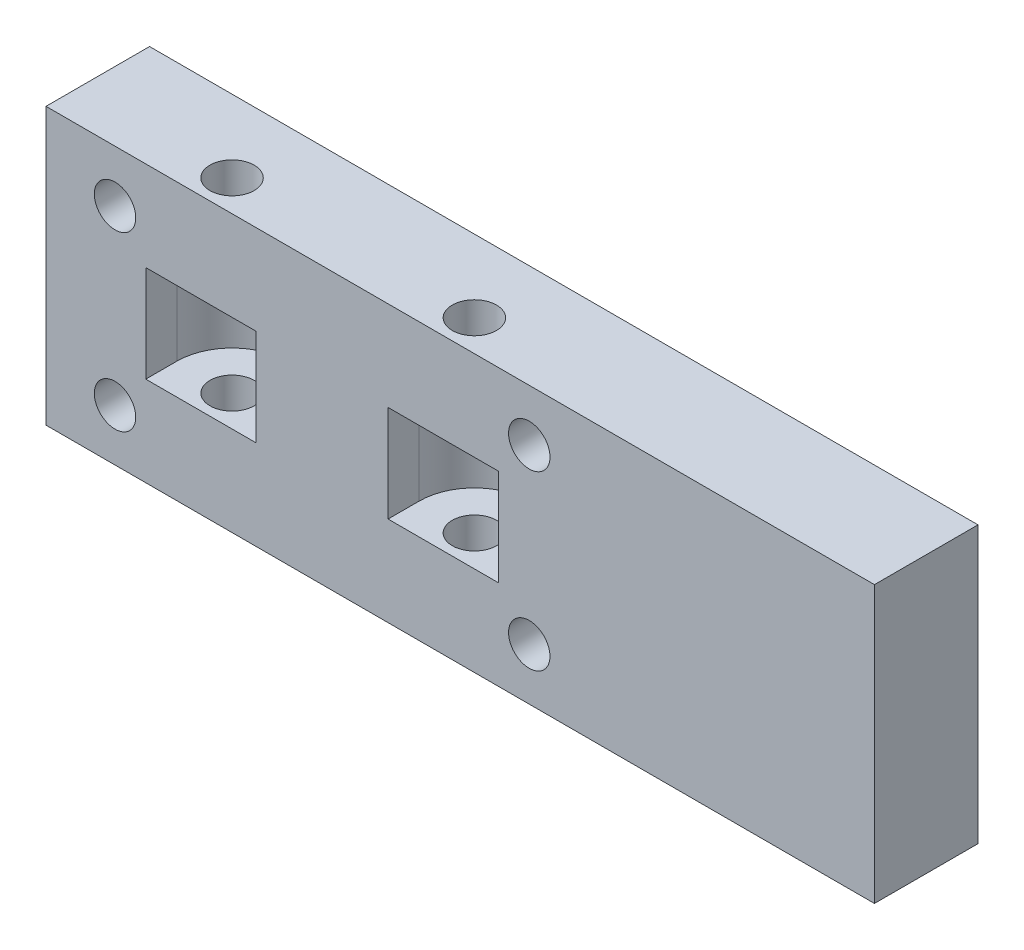
ISO-10303-21;
HEADER;
FILE_DESCRIPTION(('STEP AP214'),'2;1');
FILE_NAME('part.step','',(''),(''),'','','');
FILE_SCHEMA(('AUTOMOTIVE_DESIGN { 1 0 10303 214 1 1 1 1 }'));
ENDSEC;
DATA;
#1=APPLICATION_CONTEXT('core data for automotive mechanical design processes');
#2=APPLICATION_PROTOCOL_DEFINITION('international standard','automotive_design',2000,#1);
#3=PRODUCT_CONTEXT('',#1,'mechanical');
#4=PRODUCT('Part','Part','',(#3));
#5=PRODUCT_RELATED_PRODUCT_CATEGORY('part','',(#4));
#6=PRODUCT_DEFINITION_FORMATION('','',#4);
#7=PRODUCT_DEFINITION_CONTEXT('part definition',#1,'design');
#8=PRODUCT_DEFINITION('design','',#6,#7);
#9=PRODUCT_DEFINITION_SHAPE('','',#8);
#10=(LENGTH_UNIT() NAMED_UNIT(*) SI_UNIT(.MILLI.,.METRE.));
#11=(NAMED_UNIT(*) PLANE_ANGLE_UNIT() SI_UNIT($,.RADIAN.));
#12=(NAMED_UNIT(*) SI_UNIT($,.STERADIAN.) SOLID_ANGLE_UNIT());
#13=UNCERTAINTY_MEASURE_WITH_UNIT(LENGTH_MEASURE(1.E-05),#10,'distance_accuracy_value','');
#14=(GEOMETRIC_REPRESENTATION_CONTEXT(3) GLOBAL_UNCERTAINTY_ASSIGNED_CONTEXT((#13)) GLOBAL_UNIT_ASSIGNED_CONTEXT((#10,
#11,#12)) REPRESENTATION_CONTEXT('',''));
#15=CARTESIAN_POINT('',(0.,0.,0.));
#16=DIRECTION('',(0.,0.,1.));
#17=DIRECTION('',(1.,0.,0.));
#18=AXIS2_PLACEMENT_3D('',#15,#16,#17);
#19=CARTESIAN_POINT('',(0.,0.,9.525));
#20=DIRECTION('',(0.,0.,1.));
#21=DIRECTION('',(1.,0.,0.));
#22=AXIS2_PLACEMENT_3D('',#19,#20,#21);
#23=PLANE('',#22);
#24=CARTESIAN_POINT('',(6.35,7.93749999999999,9.525));
#25=DIRECTION('',(0.,0.,-1.));
#26=DIRECTION('',(-1.,0.,0.));
#27=AXIS2_PLACEMENT_3D('',#24,#25,#26);
#28=CIRCLE('',#27,1.905);
#29=CARTESIAN_POINT('',(8.255,7.93749999999999,9.525));
#30=VERTEX_POINT('',#29);
#31=EDGE_CURVE('E523',#30,#30,#28,.T.);
#32=ORIENTED_EDGE('',*,*,#31,.T.);
#33=EDGE_LOOP('',(#32));
#34=FACE_BOUND('',#33,.T.);
#35=CARTESIAN_POINT('',(6.35,-7.93749999999999,9.525));
#36=DIRECTION('',(0.,0.,1.));
#37=DIRECTION('',(-1.,0.,0.));
#38=AXIS2_PLACEMENT_3D('',#35,#36,#37);
#39=CIRCLE('',#38,1.905);
#40=CARTESIAN_POINT('',(8.255,-7.93749999999999,9.525));
#41=VERTEX_POINT('',#40);
#42=EDGE_CURVE('E525',#41,#41,#39,.T.);
#43=ORIENTED_EDGE('',*,*,#42,.F.);
#44=EDGE_LOOP('',(#43));
#45=FACE_BOUND('',#44,.T.);
#46=CARTESIAN_POINT('',(-31.75,-7.93749999999999,9.525));
#47=DIRECTION('',(0.,0.,-1.));
#48=DIRECTION('',(1.,0.,0.));
#49=AXIS2_PLACEMENT_3D('',#46,#47,#48);
#50=CIRCLE('',#49,1.905);
#51=CARTESIAN_POINT('',(-29.845,-7.93749999999999,9.525));
#52=VERTEX_POINT('',#51);
#53=EDGE_CURVE('E178',#52,#52,#50,.T.);
#54=ORIENTED_EDGE('',*,*,#53,.T.);
#55=EDGE_LOOP('',(#54));
#56=FACE_BOUND('',#55,.T.);
#57=CARTESIAN_POINT('',(-31.75,7.93749999999999,9.525));
#58=DIRECTION('',(0.,0.,1.));
#59=DIRECTION('',(1.,0.,0.));
#60=AXIS2_PLACEMENT_3D('',#57,#58,#59);
#61=CIRCLE('',#60,1.905);
#62=CARTESIAN_POINT('',(-29.845,7.93749999999999,9.525));
#63=VERTEX_POINT('',#62);
#64=EDGE_CURVE('E196',#63,#63,#61,.T.);
#65=ORIENTED_EDGE('',*,*,#64,.F.);
#66=EDGE_LOOP('',(#65));
#67=FACE_BOUND('',#66,.T.);
#68=DIRECTION('',(1.,0.,0.));
#69=VECTOR('',#68,1.);
#70=CARTESIAN_POINT('',(-38.1,-12.7,9.525));
#71=LINE('',#70,#69);
#72=CARTESIAN_POINT('',(-38.1,-12.7,9.525));
#73=VERTEX_POINT('',#72);
#74=CARTESIAN_POINT('',(38.1,-12.7,9.525));
#75=VERTEX_POINT('',#74);
#76=EDGE_CURVE('E233',#73,#75,#71,.T.);
#77=ORIENTED_EDGE('',*,*,#76,.T.);
#78=DIRECTION('',(0.,1.,0.));
#79=VECTOR('',#78,1.);
#80=CARTESIAN_POINT('',(38.1,-12.7,9.525));
#81=LINE('',#80,#79);
#82=CARTESIAN_POINT('',(38.1,12.7,9.525));
#83=VERTEX_POINT('',#82);
#84=EDGE_CURVE('E236',#75,#83,#81,.T.);
#85=ORIENTED_EDGE('',*,*,#84,.T.);
#86=DIRECTION('',(-1.,0.,0.));
#87=VECTOR('',#86,1.);
#88=CARTESIAN_POINT('',(-38.1,12.7,9.525));
#89=LINE('',#88,#87);
#90=CARTESIAN_POINT('',(-38.1,12.7,9.525));
#91=VERTEX_POINT('',#90);
#92=EDGE_CURVE('E239',#83,#91,#89,.T.);
#93=ORIENTED_EDGE('',*,*,#92,.T.);
#94=DIRECTION('',(0.,-1.,0.));
#95=VECTOR('',#94,1.);
#96=CARTESIAN_POINT('',(-38.1,-12.7,9.525));
#97=LINE('',#96,#95);
#98=EDGE_CURVE('E241',#91,#73,#97,.T.);
#99=ORIENTED_EDGE('',*,*,#98,.T.);
#100=EDGE_LOOP('',(#77,#85,#93,#99));
#101=FACE_BOUND('',#100,.T.);
#102=DIRECTION('',(0.,1.,0.));
#103=VECTOR('',#102,1.);
#104=CARTESIAN_POINT('',(-18.76425,-4.445,9.525));
#105=LINE('',#104,#103);
#106=CARTESIAN_POINT('',(-18.76425,-4.445,9.525));
#107=VERTEX_POINT('',#106);
#108=CARTESIAN_POINT('',(-18.76425,4.445,9.525));
#109=VERTEX_POINT('',#108);
#110=EDGE_CURVE('E227',#107,#109,#105,.T.);
#111=ORIENTED_EDGE('',*,*,#110,.F.);
#112=DIRECTION('',(1.,0.,0.));
#113=VECTOR('',#112,1.);
#114=CARTESIAN_POINT('',(-18.76425,-4.445,9.525));
#115=LINE('',#114,#113);
#116=CARTESIAN_POINT('',(-28.92425,-4.445,9.525));
#117=VERTEX_POINT('',#116);
#118=EDGE_CURVE('E209',#117,#107,#115,.T.);
#119=ORIENTED_EDGE('',*,*,#118,.F.);
#120=DIRECTION('',(0.,1.,0.));
#121=VECTOR('',#120,1.);
#122=CARTESIAN_POINT('',(-28.92425,-4.445,9.525));
#123=LINE('',#122,#121);
#124=CARTESIAN_POINT('',(-28.92425,4.445,9.525));
#125=VERTEX_POINT('',#124);
#126=EDGE_CURVE('E229',#117,#125,#123,.T.);
#127=ORIENTED_EDGE('',*,*,#126,.T.);
#128=DIRECTION('',(1.,0.,0.));
#129=VECTOR('',#128,1.);
#130=CARTESIAN_POINT('',(-18.76425,4.445,9.525));
#131=LINE('',#130,#129);
#132=EDGE_CURVE('E220',#125,#109,#131,.T.);
#133=ORIENTED_EDGE('',*,*,#132,.T.);
#134=EDGE_LOOP('',(#111,#119,#127,#133));
#135=FACE_BOUND('',#134,.T.);
#136=DIRECTION('',(0.,1.,0.));
#137=VECTOR('',#136,1.);
#138=CARTESIAN_POINT('',(3.52425000000001,-4.445,9.525));
#139=LINE('',#138,#137);
#140=CARTESIAN_POINT('',(3.52425000000001,-4.445,9.525));
#141=VERTEX_POINT('',#140);
#142=CARTESIAN_POINT('',(3.52425000000001,4.445,9.525));
#143=VERTEX_POINT('',#142);
#144=EDGE_CURVE('E62',#141,#143,#139,.T.);
#145=ORIENTED_EDGE('',*,*,#144,.F.);
#146=DIRECTION('',(-1.,0.,0.));
#147=VECTOR('',#146,1.);
#148=CARTESIAN_POINT('',(-6.63575,-4.445,9.525));
#149=LINE('',#148,#147);
#150=CARTESIAN_POINT('',(-6.63575,-4.445,9.525));
#151=VERTEX_POINT('',#150);
#152=EDGE_CURVE('E149',#141,#151,#149,.T.);
#153=ORIENTED_EDGE('',*,*,#152,.T.);
#154=DIRECTION('',(0.,1.,0.));
#155=VECTOR('',#154,1.);
#156=CARTESIAN_POINT('',(-6.63575,-4.445,9.525));
#157=LINE('',#156,#155);
#158=CARTESIAN_POINT('',(-6.63575,4.445,9.525));
#159=VERTEX_POINT('',#158);
#160=EDGE_CURVE('E144',#151,#159,#157,.T.);
#161=ORIENTED_EDGE('',*,*,#160,.T.);
#162=DIRECTION('',(-1.,0.,0.));
#163=VECTOR('',#162,1.);
#164=CARTESIAN_POINT('',(-6.63575,4.445,9.525));
#165=LINE('',#164,#163);
#166=EDGE_CURVE('E164',#143,#159,#165,.T.);
#167=ORIENTED_EDGE('',*,*,#166,.F.);
#168=EDGE_LOOP('',(#145,#153,#161,#167));
#169=FACE_BOUND('',#168,.T.);
#170=ADVANCED_FACE('F45',(#34,#45,#56,#67,#101,#135,#169),#23,.T.);
#171=CARTESIAN_POINT('',(-38.1,-12.7,9.525));
#172=DIRECTION('',(0.,1.,0.));
#173=DIRECTION('',(0.,0.,1.));
#174=AXIS2_PLACEMENT_3D('',#171,#172,#173);
#175=PLANE('',#174);
#176=CARTESIAN_POINT('',(-1.55575,-12.7,6.6675));
#177=DIRECTION('',(0.,1.,0.));
#178=DIRECTION('',(0.,0.,1.));
#179=AXIS2_PLACEMENT_3D('',#176,#177,#178);
#180=CIRCLE('',#179,2.032);
#181=CARTESIAN_POINT('',(-1.55575,-12.7,8.6995));
#182=VERTEX_POINT('',#181);
#183=EDGE_CURVE('E167',#182,#182,#180,.F.);
#184=ORIENTED_EDGE('',*,*,#183,.F.);
#185=EDGE_LOOP('',(#184));
#186=FACE_BOUND('',#185,.T.);
#187=CARTESIAN_POINT('',(-23.84425,-12.7,6.6675));
#188=DIRECTION('',(0.,1.,0.));
#189=DIRECTION('',(0.,0.,1.));
#190=AXIS2_PLACEMENT_3D('',#187,#188,#189);
#191=CIRCLE('',#190,2.032);
#192=CARTESIAN_POINT('',(-23.84425,-12.7,8.6995));
#193=VERTEX_POINT('',#192);
#194=EDGE_CURVE('E193',#193,#193,#191,.T.);
#195=ORIENTED_EDGE('',*,*,#194,.T.);
#196=EDGE_LOOP('',(#195));
#197=FACE_BOUND('',#196,.T.);
#198=DIRECTION('',(1.,0.,0.));
#199=VECTOR('',#198,1.);
#200=CARTESIAN_POINT('',(-38.1,-12.7,0.));
#201=LINE('',#200,#199);
#202=CARTESIAN_POINT('',(-38.1,-12.7,0.));
#203=VERTEX_POINT('',#202);
#204=CARTESIAN_POINT('',(38.1,-12.7,0.));
#205=VERTEX_POINT('',#204);
#206=EDGE_CURVE('E226',#203,#205,#201,.T.);
#207=ORIENTED_EDGE('',*,*,#206,.T.);
#208=DIRECTION('',(0.,0.,-1.));
#209=VECTOR('',#208,1.);
#210=CARTESIAN_POINT('',(38.1,-12.7,9.525));
#211=LINE('',#210,#209);
#212=EDGE_CURVE('E11',#75,#205,#211,.T.);
#213=ORIENTED_EDGE('',*,*,#212,.F.);
#214=ORIENTED_EDGE('',*,*,#76,.F.);
#215=DIRECTION('',(0.,0.,-1.));
#216=VECTOR('',#215,1.);
#217=CARTESIAN_POINT('',(-38.1,-12.7,9.525));
#218=LINE('',#217,#216);
#219=EDGE_CURVE('E243',#73,#203,#218,.T.);
#220=ORIENTED_EDGE('',*,*,#219,.T.);
#221=EDGE_LOOP('',(#207,#213,#214,#220));
#222=FACE_BOUND('',#221,.T.);
#223=ADVANCED_FACE('F47',(#186,#197,#222),#175,.F.);
#224=CARTESIAN_POINT('',(38.1,-12.7,9.525));
#225=DIRECTION('',(-1.,0.,0.));
#226=DIRECTION('',(0.,0.,1.));
#227=AXIS2_PLACEMENT_3D('',#224,#225,#226);
#228=PLANE('',#227);
#229=DIRECTION('',(0.,1.,0.));
#230=VECTOR('',#229,1.);
#231=CARTESIAN_POINT('',(38.1,-12.7,0.));
#232=LINE('',#231,#230);
#233=CARTESIAN_POINT('',(38.1,12.7,0.));
#234=VERTEX_POINT('',#233);
#235=EDGE_CURVE('E246',#205,#234,#232,.T.);
#236=ORIENTED_EDGE('',*,*,#235,.T.);
#237=DIRECTION('',(0.,0.,-1.));
#238=VECTOR('',#237,1.);
#239=CARTESIAN_POINT('',(38.1,12.7,9.525));
#240=LINE('',#239,#238);
#241=EDGE_CURVE('E54',#83,#234,#240,.T.);
#242=ORIENTED_EDGE('',*,*,#241,.F.);
#243=ORIENTED_EDGE('',*,*,#84,.F.);
#244=ORIENTED_EDGE('',*,*,#212,.T.);
#245=EDGE_LOOP('',(#236,#242,#243,#244));
#246=FACE_BOUND('',#245,.T.);
#247=ADVANCED_FACE('F285',(#246),#228,.F.);
#248=CARTESIAN_POINT('',(-38.1,12.7,9.525));
#249=DIRECTION('',(0.,-1.,0.));
#250=DIRECTION('',(1.,0.,0.));
#251=AXIS2_PLACEMENT_3D('',#248,#249,#250);
#252=PLANE('',#251);
#253=CARTESIAN_POINT('',(-1.55575,12.7,6.6675));
#254=DIRECTION('',(0.,-1.,0.));
#255=DIRECTION('',(0.,0.,1.));
#256=AXIS2_PLACEMENT_3D('',#253,#254,#255);
#257=CIRCLE('',#256,2.032);
#258=CARTESIAN_POINT('',(-1.55575,12.7,8.6995));
#259=VERTEX_POINT('',#258);
#260=EDGE_CURVE('E531',#259,#259,#257,.T.);
#261=ORIENTED_EDGE('',*,*,#260,.T.);
#262=EDGE_LOOP('',(#261));
#263=FACE_BOUND('',#262,.T.);
#264=CARTESIAN_POINT('',(-23.84425,12.7,6.6675));
#265=DIRECTION('',(0.,1.,0.));
#266=DIRECTION('',(0.,0.,1.));
#267=AXIS2_PLACEMENT_3D('',#264,#265,#266);
#268=CIRCLE('',#267,2.032);
#269=CARTESIAN_POINT('',(-23.84425,12.7,8.6995));
#270=VERTEX_POINT('',#269);
#271=EDGE_CURVE('E184',#270,#270,#268,.T.);
#272=ORIENTED_EDGE('',*,*,#271,.F.);
#273=EDGE_LOOP('',(#272));
#274=FACE_BOUND('',#273,.T.);
#275=DIRECTION('',(-1.,0.,0.));
#276=VECTOR('',#275,1.);
#277=CARTESIAN_POINT('',(-38.1,12.7,0.));
#278=LINE('',#277,#276);
#279=CARTESIAN_POINT('',(-38.1,12.7,0.));
#280=VERTEX_POINT('',#279);
#281=EDGE_CURVE('E248',#234,#280,#278,.T.);
#282=ORIENTED_EDGE('',*,*,#281,.T.);
#283=DIRECTION('',(0.,0.,-1.));
#284=VECTOR('',#283,1.);
#285=CARTESIAN_POINT('',(-38.1,12.7,9.525));
#286=LINE('',#285,#284);
#287=EDGE_CURVE('E253',#91,#280,#286,.T.);
#288=ORIENTED_EDGE('',*,*,#287,.F.);
#289=ORIENTED_EDGE('',*,*,#92,.F.);
#290=ORIENTED_EDGE('',*,*,#241,.T.);
#291=EDGE_LOOP('',(#282,#288,#289,#290));
#292=FACE_BOUND('',#291,.T.);
#293=ADVANCED_FACE('F300',(#263,#274,#292),#252,.F.);
#294=CARTESIAN_POINT('',(-38.1,-12.7,9.525));
#295=DIRECTION('',(1.,0.,0.));
#296=DIRECTION('',(0.,0.,-1.));
#297=AXIS2_PLACEMENT_3D('',#294,#295,#296);
#298=PLANE('',#297);
#299=DIRECTION('',(0.,-1.,0.));
#300=VECTOR('',#299,1.);
#301=CARTESIAN_POINT('',(-38.1,-12.7,0.));
#302=LINE('',#301,#300);
#303=EDGE_CURVE('E237',#280,#203,#302,.T.);
#304=ORIENTED_EDGE('',*,*,#303,.T.);
#305=ORIENTED_EDGE('',*,*,#219,.F.);
#306=ORIENTED_EDGE('',*,*,#98,.F.);
#307=ORIENTED_EDGE('',*,*,#287,.T.);
#308=EDGE_LOOP('',(#304,#305,#306,#307));
#309=FACE_BOUND('',#308,.T.);
#310=ADVANCED_FACE('F296',(#309),#298,.F.);
#311=CARTESIAN_POINT('',(0.,0.,0.));
#312=DIRECTION('',(0.,0.,1.));
#313=DIRECTION('',(1.,0.,0.));
#314=AXIS2_PLACEMENT_3D('',#311,#312,#313);
#315=PLANE('',#314);
#316=CARTESIAN_POINT('',(6.35,7.93749999999999,0.));
#317=DIRECTION('',(0.,0.,-1.));
#318=DIRECTION('',(-1.,0.,0.));
#319=AXIS2_PLACEMENT_3D('',#316,#317,#318);
#320=CIRCLE('',#319,1.905);
#321=CARTESIAN_POINT('',(8.255,7.93749999999999,0.));
#322=VERTEX_POINT('',#321);
#323=EDGE_CURVE('E521',#322,#322,#320,.T.);
#324=ORIENTED_EDGE('',*,*,#323,.F.);
#325=EDGE_LOOP('',(#324));
#326=FACE_BOUND('',#325,.T.);
#327=CARTESIAN_POINT('',(6.35,-7.93749999999999,0.));
#328=DIRECTION('',(0.,0.,1.));
#329=DIRECTION('',(-1.,0.,0.));
#330=AXIS2_PLACEMENT_3D('',#327,#328,#329);
#331=CIRCLE('',#330,1.905);
#332=CARTESIAN_POINT('',(8.255,-7.93749999999999,0.));
#333=VERTEX_POINT('',#332);
#334=EDGE_CURVE('E528',#333,#333,#331,.T.);
#335=ORIENTED_EDGE('',*,*,#334,.T.);
#336=EDGE_LOOP('',(#335));
#337=FACE_BOUND('',#336,.T.);
#338=CARTESIAN_POINT('',(-31.75,-7.93749999999999,0.));
#339=DIRECTION('',(0.,0.,-1.));
#340=DIRECTION('',(1.,0.,0.));
#341=AXIS2_PLACEMENT_3D('',#338,#339,#340);
#342=CIRCLE('',#341,1.905);
#343=CARTESIAN_POINT('',(-29.845,-7.93749999999999,0.));
#344=VERTEX_POINT('',#343);
#345=EDGE_CURVE('E181',#344,#344,#342,.T.);
#346=ORIENTED_EDGE('',*,*,#345,.F.);
#347=EDGE_LOOP('',(#346));
#348=FACE_BOUND('',#347,.T.);
#349=CARTESIAN_POINT('',(-31.75,7.93749999999999,0.));
#350=DIRECTION('',(0.,0.,1.));
#351=DIRECTION('',(1.,0.,0.));
#352=AXIS2_PLACEMENT_3D('',#349,#350,#351);
#353=CIRCLE('',#352,1.905);
#354=CARTESIAN_POINT('',(-29.845,7.93749999999999,0.));
#355=VERTEX_POINT('',#354);
#356=EDGE_CURVE('E197',#355,#355,#353,.T.);
#357=ORIENTED_EDGE('',*,*,#356,.T.);
#358=EDGE_LOOP('',(#357));
#359=FACE_BOUND('',#358,.T.);
#360=ORIENTED_EDGE('',*,*,#206,.F.);
#361=ORIENTED_EDGE('',*,*,#303,.F.);
#362=ORIENTED_EDGE('',*,*,#281,.F.);
#363=ORIENTED_EDGE('',*,*,#235,.F.);
#364=EDGE_LOOP('',(#360,#361,#362,#363));
#365=FACE_BOUND('',#364,.T.);
#366=ADVANCED_FACE('F293',(#326,#337,#348,#359,#365),#315,.F.);
#367=CARTESIAN_POINT('',(-23.84425,-4.445,6.6675));
#368=DIRECTION('',(0.,1.,0.));
#369=DIRECTION('',(0.,0.,1.));
#370=AXIS2_PLACEMENT_3D('',#367,#368,#369);
#371=CYLINDRICAL_SURFACE('',#370,5.08);
#372=CARTESIAN_POINT('',(-23.84425,4.445,6.6675));
#373=DIRECTION('',(0.,1.,0.));
#374=DIRECTION('',(0.,0.,1.));
#375=AXIS2_PLACEMENT_3D('',#372,#373,#374);
#376=CIRCLE('',#375,5.08);
#377=CARTESIAN_POINT('',(-18.76425,4.445,6.6675));
#378=VERTEX_POINT('',#377);
#379=CARTESIAN_POINT('',(-28.92425,4.445,6.6675));
#380=VERTEX_POINT('',#379);
#381=EDGE_CURVE('E200',#378,#380,#376,.T.);
#382=ORIENTED_EDGE('',*,*,#381,.T.);
#383=DIRECTION('',(0.,1.,0.));
#384=VECTOR('',#383,1.);
#385=CARTESIAN_POINT('',(-28.92425,-4.445,6.6675));
#386=LINE('',#385,#384);
#387=CARTESIAN_POINT('',(-28.92425,-4.445,6.6675));
#388=VERTEX_POINT('',#387);
#389=EDGE_CURVE('E214',#388,#380,#386,.T.);
#390=ORIENTED_EDGE('',*,*,#389,.F.);
#391=CARTESIAN_POINT('',(-23.84425,-4.445,6.6675));
#392=DIRECTION('',(0.,1.,0.));
#393=DIRECTION('',(0.,0.,1.));
#394=AXIS2_PLACEMENT_3D('',#391,#392,#393);
#395=CIRCLE('',#394,5.08);
#396=CARTESIAN_POINT('',(-18.76425,-4.445,6.6675));
#397=VERTEX_POINT('',#396);
#398=EDGE_CURVE('E203',#397,#388,#395,.T.);
#399=ORIENTED_EDGE('',*,*,#398,.F.);
#400=DIRECTION('',(0.,1.,0.));
#401=VECTOR('',#400,1.);
#402=CARTESIAN_POINT('',(-18.76425,-4.445,6.6675));
#403=LINE('',#402,#401);
#404=EDGE_CURVE('E224',#397,#378,#403,.T.);
#405=ORIENTED_EDGE('',*,*,#404,.T.);
#406=EDGE_LOOP('',(#382,#390,#399,#405));
#407=FACE_BOUND('',#406,.T.);
#408=ADVANCED_FACE('F291',(#407),#371,.F.);
#409=CARTESIAN_POINT('',(-18.76425,-4.445,6.6675));
#410=DIRECTION('',(1.,0.,0.));
#411=DIRECTION('',(0.,0.,-1.));
#412=AXIS2_PLACEMENT_3D('',#409,#410,#411);
#413=PLANE('',#412);
#414=DIRECTION('',(0.,0.,-1.));
#415=VECTOR('',#414,1.);
#416=CARTESIAN_POINT('',(-18.76425,4.445,6.6675));
#417=LINE('',#416,#415);
#418=EDGE_CURVE('E70',#109,#378,#417,.T.);
#419=ORIENTED_EDGE('',*,*,#418,.T.);
#420=ORIENTED_EDGE('',*,*,#404,.F.);
#421=DIRECTION('',(0.,0.,-1.));
#422=VECTOR('',#421,1.);
#423=CARTESIAN_POINT('',(-18.76425,-4.445,6.6675));
#424=LINE('',#423,#422);
#425=EDGE_CURVE('E211',#107,#397,#424,.T.);
#426=ORIENTED_EDGE('',*,*,#425,.F.);
#427=ORIENTED_EDGE('',*,*,#110,.T.);
#428=EDGE_LOOP('',(#419,#420,#426,#427));
#429=FACE_BOUND('',#428,.T.);
#430=ADVANCED_FACE('F396',(#429),#413,.F.);
#431=CARTESIAN_POINT('',(-28.92425,-4.445,6.6675));
#432=DIRECTION('',(-1.,0.,0.));
#433=DIRECTION('',(0.,0.,1.));
#434=AXIS2_PLACEMENT_3D('',#431,#432,#433);
#435=PLANE('',#434);
#436=DIRECTION('',(0.,0.,1.));
#437=VECTOR('',#436,1.);
#438=CARTESIAN_POINT('',(-28.92425,4.445,6.6675));
#439=LINE('',#438,#437);
#440=EDGE_CURVE('E217',#380,#125,#439,.T.);
#441=ORIENTED_EDGE('',*,*,#440,.T.);
#442=ORIENTED_EDGE('',*,*,#126,.F.);
#443=DIRECTION('',(0.,0.,1.));
#444=VECTOR('',#443,1.);
#445=CARTESIAN_POINT('',(-28.92425,-4.445,6.6675));
#446=LINE('',#445,#444);
#447=EDGE_CURVE('E206',#388,#117,#446,.T.);
#448=ORIENTED_EDGE('',*,*,#447,.F.);
#449=ORIENTED_EDGE('',*,*,#389,.T.);
#450=EDGE_LOOP('',(#441,#442,#448,#449));
#451=FACE_BOUND('',#450,.T.);
#452=ADVANCED_FACE('F387',(#451),#435,.F.);
#453=CARTESIAN_POINT('',(-23.84425,-4.445,6.6675));
#454=DIRECTION('',(0.,1.,0.));
#455=DIRECTION('',(0.,0.,1.));
#456=AXIS2_PLACEMENT_3D('',#453,#454,#455);
#457=PLANE('',#456);
#458=CARTESIAN_POINT('',(-23.84425,-4.445,6.6675));
#459=DIRECTION('',(0.,1.,0.));
#460=DIRECTION('',(0.,0.,1.));
#461=AXIS2_PLACEMENT_3D('',#458,#459,#460);
#462=CIRCLE('',#461,2.032);
#463=CARTESIAN_POINT('',(-23.84425,-4.445,8.6995));
#464=VERTEX_POINT('',#463);
#465=EDGE_CURVE('E190',#464,#464,#462,.T.);
#466=ORIENTED_EDGE('',*,*,#465,.F.);
#467=EDGE_LOOP('',(#466));
#468=FACE_BOUND('',#467,.T.);
#469=ORIENTED_EDGE('',*,*,#398,.T.);
#470=ORIENTED_EDGE('',*,*,#447,.T.);
#471=ORIENTED_EDGE('',*,*,#118,.T.);
#472=ORIENTED_EDGE('',*,*,#425,.T.);
#473=EDGE_LOOP('',(#469,#470,#471,#472));
#474=FACE_BOUND('',#473,.T.);
#475=ADVANCED_FACE('F379',(#468,#474),#457,.T.);
#476=CARTESIAN_POINT('',(-23.84425,4.445,6.6675));
#477=DIRECTION('',(0.,1.,0.));
#478=DIRECTION('',(0.,0.,1.));
#479=AXIS2_PLACEMENT_3D('',#476,#477,#478);
#480=PLANE('',#479);
#481=CARTESIAN_POINT('',(-23.84425,4.445,6.6675));
#482=DIRECTION('',(0.,1.,0.));
#483=DIRECTION('',(0.,0.,1.));
#484=AXIS2_PLACEMENT_3D('',#481,#482,#483);
#485=CIRCLE('',#484,2.032);
#486=CARTESIAN_POINT('',(-23.84425,4.445,8.6995));
#487=VERTEX_POINT('',#486);
#488=EDGE_CURVE('E189',#487,#487,#485,.T.);
#489=ORIENTED_EDGE('',*,*,#488,.T.);
#490=EDGE_LOOP('',(#489));
#491=FACE_BOUND('',#490,.T.);
#492=ORIENTED_EDGE('',*,*,#381,.F.);
#493=ORIENTED_EDGE('',*,*,#418,.F.);
#494=ORIENTED_EDGE('',*,*,#132,.F.);
#495=ORIENTED_EDGE('',*,*,#440,.F.);
#496=EDGE_LOOP('',(#492,#493,#494,#495));
#497=FACE_BOUND('',#496,.T.);
#498=ADVANCED_FACE('F260',(#491,#497),#480,.F.);
#499=CARTESIAN_POINT('',(-31.75,7.93749999999999,0.));
#500=DIRECTION('',(0.,0.,1.));
#501=DIRECTION('',(1.,0.,0.));
#502=AXIS2_PLACEMENT_3D('',#499,#500,#501);
#503=CYLINDRICAL_SURFACE('',#502,1.905);
#504=CARTESIAN_POINT('',(-29.845,7.93749999999999,0.));
#505=CARTESIAN_POINT('',(-29.845,7.93749999999999,0.0992187499999999));
#506=CARTESIAN_POINT('',(-29.845,7.93749999999999,0.1984375));
#507=CARTESIAN_POINT('',(-29.845,7.93749999999999,0.396875));
#508=CARTESIAN_POINT('',(-29.845,7.93749999999999,0.49609375));
#509=CARTESIAN_POINT('',(-29.845,7.93749999999999,0.69453125));
#510=CARTESIAN_POINT('',(-29.845,7.93749999999999,0.79375));
#511=CARTESIAN_POINT('',(-29.845,7.93749999999999,0.9921875));
#512=CARTESIAN_POINT('',(-29.845,7.93749999999999,1.09140625));
#513=CARTESIAN_POINT('',(-29.845,7.93749999999999,1.28984375));
#514=CARTESIAN_POINT('',(-29.845,7.93749999999999,1.3890625));
#515=CARTESIAN_POINT('',(-29.845,7.93749999999999,1.5875));
#516=CARTESIAN_POINT('',(-29.845,7.93749999999999,1.68671875));
#517=CARTESIAN_POINT('',(-29.845,7.93749999999999,1.88515625));
#518=CARTESIAN_POINT('',(-29.845,7.93749999999999,1.984375));
#519=CARTESIAN_POINT('',(-29.845,7.93749999999999,2.1828125));
#520=CARTESIAN_POINT('',(-29.845,7.93749999999999,2.28203125));
#521=CARTESIAN_POINT('',(-29.845,7.93749999999999,2.48046875));
#522=CARTESIAN_POINT('',(-29.845,7.93749999999999,2.5796875));
#523=CARTESIAN_POINT('',(-29.845,7.93749999999999,2.778125));
#524=CARTESIAN_POINT('',(-29.845,7.93749999999999,2.87734375));
#525=CARTESIAN_POINT('',(-29.845,7.93749999999999,3.07578125));
#526=CARTESIAN_POINT('',(-29.845,7.93749999999999,3.175));
#527=CARTESIAN_POINT('',(-29.845,7.93749999999999,3.3734375));
#528=CARTESIAN_POINT('',(-29.845,7.93749999999999,3.47265625));
#529=CARTESIAN_POINT('',(-29.845,7.93749999999999,3.67109375));
#530=CARTESIAN_POINT('',(-29.845,7.93749999999999,3.7703125));
#531=CARTESIAN_POINT('',(-29.845,7.93749999999999,3.96875));
#532=CARTESIAN_POINT('',(-29.845,7.93749999999999,4.06796875));
#533=CARTESIAN_POINT('',(-29.845,7.93749999999999,4.26640625));
#534=CARTESIAN_POINT('',(-29.845,7.93749999999999,4.365625));
#535=CARTESIAN_POINT('',(-29.845,7.93749999999999,4.5640625));
#536=CARTESIAN_POINT('',(-29.845,7.93749999999999,4.66328125));
#537=CARTESIAN_POINT('',(-29.845,7.93749999999999,4.86171875));
#538=CARTESIAN_POINT('',(-29.845,7.93749999999999,4.9609375));
#539=CARTESIAN_POINT('',(-29.845,7.93749999999999,5.159375));
#540=CARTESIAN_POINT('',(-29.845,7.93749999999999,5.25859375));
#541=CARTESIAN_POINT('',(-29.845,7.93749999999999,5.45703125));
#542=CARTESIAN_POINT('',(-29.845,7.93749999999999,5.55625));
#543=CARTESIAN_POINT('',(-29.845,7.93749999999999,5.7546875));
#544=CARTESIAN_POINT('',(-29.845,7.93749999999999,5.85390625));
#545=CARTESIAN_POINT('',(-29.845,7.93749999999999,6.05234375));
#546=CARTESIAN_POINT('',(-29.845,7.93749999999999,6.1515625));
#547=CARTESIAN_POINT('',(-29.845,7.93749999999999,6.35));
#548=CARTESIAN_POINT('',(-29.845,7.93749999999999,6.44921875));
#549=CARTESIAN_POINT('',(-29.845,7.93749999999999,6.64765625));
#550=CARTESIAN_POINT('',(-29.845,7.93749999999999,6.746875));
#551=CARTESIAN_POINT('',(-29.845,7.93749999999999,6.9453125));
#552=CARTESIAN_POINT('',(-29.845,7.93749999999999,7.04453125));
#553=CARTESIAN_POINT('',(-29.845,7.93749999999999,7.24296875));
#554=CARTESIAN_POINT('',(-29.845,7.93749999999999,7.3421875));
#555=CARTESIAN_POINT('',(-29.845,7.93749999999999,7.540625));
#556=CARTESIAN_POINT('',(-29.845,7.93749999999999,7.63984375));
#557=CARTESIAN_POINT('',(-29.845,7.93749999999999,7.83828125));
#558=CARTESIAN_POINT('',(-29.845,7.93749999999999,7.9375));
#559=CARTESIAN_POINT('',(-29.845,7.93749999999999,8.1359375));
#560=CARTESIAN_POINT('',(-29.845,7.93749999999999,8.23515625));
#561=CARTESIAN_POINT('',(-29.845,7.93749999999999,8.43359375));
#562=CARTESIAN_POINT('',(-29.845,7.93749999999999,8.5328125));
#563=CARTESIAN_POINT('',(-29.845,7.93749999999999,8.73125));
#564=CARTESIAN_POINT('',(-29.845,7.93749999999999,8.83046875));
#565=CARTESIAN_POINT('',(-29.845,7.93749999999999,9.02890625));
#566=CARTESIAN_POINT('',(-29.845,7.93749999999999,9.128125));
#567=CARTESIAN_POINT('',(-29.845,7.93749999999999,9.3265625));
#568=CARTESIAN_POINT('',(-29.845,7.93749999999999,9.42578125));
#569=CARTESIAN_POINT('',(-29.845,7.93749999999999,9.525));
#570=B_SPLINE_CURVE_WITH_KNOTS('',3,(#504,#505,#506,#507,#508,#509,#510,#511,#512,#513,#514,
#515,#516,#517,#518,#519,#520,#521,#522,#523,#524,#525,#526,#527,#528,#529,#530,#531,#532,#533,
#534,#535,#536,#537,#538,#539,#540,#541,#542,#543,#544,#545,#546,#547,#548,#549,#550,#551,#552,
#553,#554,#555,#556,#557,#558,#559,#560,#561,#562,#563,#564,#565,#566,#567,#568,#569),
.UNSPECIFIED.,.F.,.F.,(4,2,2,2,2,2,2,2,2,2,2,2,2,2,2,2,2,2,2,2,2,2,2,2,2,2,2,2,2,2,2,2,4),(0.,
0.29765625,0.5953125,0.89296875,1.190625,1.48828125,1.7859375,2.08359375,2.38125,2.67890625,
2.9765625,3.27421875,3.571875,3.86953125,4.1671875,4.46484375,4.7625,5.06015625,5.3578125,
5.65546875,5.953125,6.25078125,6.5484375,6.84609375,7.14375,7.44140625,7.7390625,8.03671875,
8.334375,8.63203125,8.9296875,9.22734375,9.525),.UNSPECIFIED.);
#571=EDGE_CURVE('BSEAM265',#355,#63,#570,.T.);
#572=ORIENTED_EDGE('',*,*,#356,.F.);
#573=ORIENTED_EDGE('',*,*,#64,.T.);
#574=ORIENTED_EDGE('',*,*,#571,.T.);
#575=ORIENTED_EDGE('',*,*,#571,.F.);
#576=EDGE_LOOP('',(#572,#574,#573,#575));
#577=FACE_BOUND('',#576,.T.);
#578=ADVANCED_FACE('F265',(#577),#503,.F.);
#579=CARTESIAN_POINT('',(-23.84425,-15.875,6.6675));
#580=DIRECTION('',(0.,1.,0.));
#581=DIRECTION('',(0.,0.,1.));
#582=AXIS2_PLACEMENT_3D('',#579,#580,#581);
#583=CYLINDRICAL_SURFACE('',#582,2.032);
#584=ORIENTED_EDGE('',*,*,#271,.T.);
#585=EDGE_LOOP('',(#584));
#586=FACE_BOUND('',#585,.T.);
#587=ORIENTED_EDGE('',*,*,#488,.F.);
#588=EDGE_LOOP('',(#587));
#589=FACE_BOUND('',#588,.T.);
#590=ADVANCED_FACE('F262',(#586,#589),#583,.F.);
#591=ORIENTED_EDGE('',*,*,#465,.T.);
#592=EDGE_LOOP('',(#591));
#593=FACE_BOUND('',#592,.T.);
#594=ORIENTED_EDGE('',*,*,#194,.F.);
#595=EDGE_LOOP('',(#594));
#596=FACE_BOUND('',#595,.T.);
#597=ADVANCED_FACE('F264',(#593,#596),#583,.F.);
#598=CARTESIAN_POINT('',(-31.75,-7.93749999999999,0.));
#599=DIRECTION('',(0.,0.,1.));
#600=DIRECTION('',(1.,0.,0.));
#601=AXIS2_PLACEMENT_3D('',#598,#599,#600);
#602=CYLINDRICAL_SURFACE('',#601,1.905);
#603=CARTESIAN_POINT('',(-29.845,-7.93749999999999,0.));
#604=CARTESIAN_POINT('',(-29.845,-7.93749999999999,0.0992187499999999));
#605=CARTESIAN_POINT('',(-29.845,-7.93749999999999,0.1984375));
#606=CARTESIAN_POINT('',(-29.845,-7.93749999999999,0.396875));
#607=CARTESIAN_POINT('',(-29.845,-7.93749999999999,0.49609375));
#608=CARTESIAN_POINT('',(-29.845,-7.93749999999999,0.69453125));
#609=CARTESIAN_POINT('',(-29.845,-7.93749999999999,0.79375));
#610=CARTESIAN_POINT('',(-29.845,-7.93749999999999,0.9921875));
#611=CARTESIAN_POINT('',(-29.845,-7.93749999999999,1.09140625));
#612=CARTESIAN_POINT('',(-29.845,-7.93749999999999,1.28984375));
#613=CARTESIAN_POINT('',(-29.845,-7.93749999999999,1.3890625));
#614=CARTESIAN_POINT('',(-29.845,-7.93749999999999,1.5875));
#615=CARTESIAN_POINT('',(-29.845,-7.93749999999999,1.68671875));
#616=CARTESIAN_POINT('',(-29.845,-7.93749999999999,1.88515625));
#617=CARTESIAN_POINT('',(-29.845,-7.93749999999999,1.984375));
#618=CARTESIAN_POINT('',(-29.845,-7.93749999999999,2.1828125));
#619=CARTESIAN_POINT('',(-29.845,-7.93749999999999,2.28203125));
#620=CARTESIAN_POINT('',(-29.845,-7.93749999999999,2.48046875));
#621=CARTESIAN_POINT('',(-29.845,-7.93749999999999,2.5796875));
#622=CARTESIAN_POINT('',(-29.845,-7.93749999999999,2.778125));
#623=CARTESIAN_POINT('',(-29.845,-7.93749999999999,2.87734375));
#624=CARTESIAN_POINT('',(-29.845,-7.93749999999999,3.07578125));
#625=CARTESIAN_POINT('',(-29.845,-7.93749999999999,3.175));
#626=CARTESIAN_POINT('',(-29.845,-7.93749999999999,3.3734375));
#627=CARTESIAN_POINT('',(-29.845,-7.93749999999999,3.47265625));
#628=CARTESIAN_POINT('',(-29.845,-7.93749999999999,3.67109375));
#629=CARTESIAN_POINT('',(-29.845,-7.93749999999999,3.7703125));
#630=CARTESIAN_POINT('',(-29.845,-7.93749999999999,3.96875));
#631=CARTESIAN_POINT('',(-29.845,-7.93749999999999,4.06796875));
#632=CARTESIAN_POINT('',(-29.845,-7.93749999999999,4.26640625));
#633=CARTESIAN_POINT('',(-29.845,-7.93749999999999,4.365625));
#634=CARTESIAN_POINT('',(-29.845,-7.93749999999999,4.5640625));
#635=CARTESIAN_POINT('',(-29.845,-7.93749999999999,4.66328125));
#636=CARTESIAN_POINT('',(-29.845,-7.93749999999999,4.86171875));
#637=CARTESIAN_POINT('',(-29.845,-7.93749999999999,4.9609375));
#638=CARTESIAN_POINT('',(-29.845,-7.93749999999999,5.159375));
#639=CARTESIAN_POINT('',(-29.845,-7.93749999999999,5.25859375));
#640=CARTESIAN_POINT('',(-29.845,-7.93749999999999,5.45703125));
#641=CARTESIAN_POINT('',(-29.845,-7.93749999999999,5.55625));
#642=CARTESIAN_POINT('',(-29.845,-7.93749999999999,5.7546875));
#643=CARTESIAN_POINT('',(-29.845,-7.93749999999999,5.85390625));
#644=CARTESIAN_POINT('',(-29.845,-7.93749999999999,6.05234375));
#645=CARTESIAN_POINT('',(-29.845,-7.93749999999999,6.1515625));
#646=CARTESIAN_POINT('',(-29.845,-7.93749999999999,6.35));
#647=CARTESIAN_POINT('',(-29.845,-7.93749999999999,6.44921875));
#648=CARTESIAN_POINT('',(-29.845,-7.93749999999999,6.64765625));
#649=CARTESIAN_POINT('',(-29.845,-7.93749999999999,6.746875));
#650=CARTESIAN_POINT('',(-29.845,-7.93749999999999,6.9453125));
#651=CARTESIAN_POINT('',(-29.845,-7.93749999999999,7.04453125));
#652=CARTESIAN_POINT('',(-29.845,-7.93749999999999,7.24296875));
#653=CARTESIAN_POINT('',(-29.845,-7.93749999999999,7.3421875));
#654=CARTESIAN_POINT('',(-29.845,-7.93749999999999,7.540625));
#655=CARTESIAN_POINT('',(-29.845,-7.93749999999999,7.63984375));
#656=CARTESIAN_POINT('',(-29.845,-7.93749999999999,7.83828125));
#657=CARTESIAN_POINT('',(-29.845,-7.93749999999999,7.9375));
#658=CARTESIAN_POINT('',(-29.845,-7.93749999999999,8.1359375));
#659=CARTESIAN_POINT('',(-29.845,-7.93749999999999,8.23515625));
#660=CARTESIAN_POINT('',(-29.845,-7.93749999999999,8.43359375));
#661=CARTESIAN_POINT('',(-29.845,-7.93749999999999,8.5328125));
#662=CARTESIAN_POINT('',(-29.845,-7.93749999999999,8.73125));
#663=CARTESIAN_POINT('',(-29.845,-7.93749999999999,8.83046875));
#664=CARTESIAN_POINT('',(-29.845,-7.93749999999999,9.02890625));
#665=CARTESIAN_POINT('',(-29.845,-7.93749999999999,9.128125));
#666=CARTESIAN_POINT('',(-29.845,-7.93749999999999,9.3265625));
#667=CARTESIAN_POINT('',(-29.845,-7.93749999999999,9.42578125));
#668=CARTESIAN_POINT('',(-29.845,-7.93749999999999,9.525));
#669=B_SPLINE_CURVE_WITH_KNOTS('',3,(#603,#604,#605,#606,#607,#608,#609,#610,#611,#612,#613,
#614,#615,#616,#617,#618,#619,#620,#621,#622,#623,#624,#625,#626,#627,#628,#629,#630,#631,#632,
#633,#634,#635,#636,#637,#638,#639,#640,#641,#642,#643,#644,#645,#646,#647,#648,#649,#650,#651,
#652,#653,#654,#655,#656,#657,#658,#659,#660,#661,#662,#663,#664,#665,#666,#667,#668),
.UNSPECIFIED.,.F.,.F.,(4,2,2,2,2,2,2,2,2,2,2,2,2,2,2,2,2,2,2,2,2,2,2,2,2,2,2,2,2,2,2,2,4),(0.,
0.29765625,0.5953125,0.89296875,1.190625,1.48828125,1.7859375,2.08359375,2.38125,2.67890625,
2.9765625,3.27421875,3.571875,3.86953125,4.1671875,4.46484375,4.7625,5.06015625,5.3578125,
5.65546875,5.953125,6.25078125,6.5484375,6.84609375,7.14375,7.44140625,7.7390625,8.03671875,
8.334375,8.63203125,8.9296875,9.22734375,9.525),.UNSPECIFIED.);
#670=EDGE_CURVE('BSEAM272',#344,#52,#669,.T.);
#671=ORIENTED_EDGE('',*,*,#345,.T.);
#672=ORIENTED_EDGE('',*,*,#53,.F.);
#673=ORIENTED_EDGE('',*,*,#670,.T.);
#674=ORIENTED_EDGE('',*,*,#670,.F.);
#675=EDGE_LOOP('',(#671,#673,#672,#674));
#676=FACE_BOUND('',#675,.T.);
#677=ADVANCED_FACE('F272',(#676),#602,.F.);
#678=CARTESIAN_POINT('',(-1.55575,-4.445,6.6675));
#679=DIRECTION('',(0.,1.,0.));
#680=DIRECTION('',(0.,0.,1.));
#681=AXIS2_PLACEMENT_3D('',#678,#679,#680);
#682=CYLINDRICAL_SURFACE('',#681,5.08);
#683=CARTESIAN_POINT('',(-1.55575,4.445,6.6675));
#684=DIRECTION('',(0.,-1.,0.));
#685=DIRECTION('',(0.,0.,1.));
#686=AXIS2_PLACEMENT_3D('',#683,#684,#685);
#687=CIRCLE('',#686,5.08);
#688=CARTESIAN_POINT('',(-6.63574999999999,4.445,6.6675));
#689=VERTEX_POINT('',#688);
#690=CARTESIAN_POINT('',(3.52425,4.445,6.6675));
#691=VERTEX_POINT('',#690);
#692=EDGE_CURVE('E158',#689,#691,#687,.T.);
#693=ORIENTED_EDGE('',*,*,#692,.F.);
#694=DIRECTION('',(0.,1.,0.));
#695=VECTOR('',#694,1.);
#696=CARTESIAN_POINT('',(-6.63574999999999,-4.445,6.6675));
#697=LINE('',#696,#695);
#698=CARTESIAN_POINT('',(-6.63574999999999,-4.445,6.6675));
#699=VERTEX_POINT('',#698);
#700=EDGE_CURVE('E141',#699,#689,#697,.T.);
#701=ORIENTED_EDGE('',*,*,#700,.F.);
#702=CARTESIAN_POINT('',(-1.55575,-4.445,6.6675));
#703=DIRECTION('',(0.,-1.,0.));
#704=DIRECTION('',(0.,0.,1.));
#705=AXIS2_PLACEMENT_3D('',#702,#703,#704);
#706=CIRCLE('',#705,5.08);
#707=CARTESIAN_POINT('',(3.52425,-4.445,6.6675));
#708=VERTEX_POINT('',#707);
#709=EDGE_CURVE('E150',#699,#708,#706,.T.);
#710=ORIENTED_EDGE('',*,*,#709,.T.);
#711=DIRECTION('',(0.,1.,0.));
#712=VECTOR('',#711,1.);
#713=CARTESIAN_POINT('',(3.52425,-4.445,6.6675));
#714=LINE('',#713,#712);
#715=EDGE_CURVE('E176',#708,#691,#714,.T.);
#716=ORIENTED_EDGE('',*,*,#715,.T.);
#717=EDGE_LOOP('',(#693,#701,#710,#716));
#718=FACE_BOUND('',#717,.T.);
#719=ADVANCED_FACE('F154',(#718),#682,.F.);
#720=CARTESIAN_POINT('',(3.52425,-4.445,6.6675));
#721=DIRECTION('',(-1.,0.,0.));
#722=DIRECTION('',(0.,0.,1.));
#723=AXIS2_PLACEMENT_3D('',#720,#721,#722);
#724=PLANE('',#723);
#725=DIRECTION('',(0.,0.,1.));
#726=VECTOR('',#725,1.);
#727=CARTESIAN_POINT('',(3.52425,4.445,6.6675));
#728=LINE('',#727,#726);
#729=EDGE_CURVE('E162',#691,#143,#728,.T.);
#730=ORIENTED_EDGE('',*,*,#729,.F.);
#731=ORIENTED_EDGE('',*,*,#715,.F.);
#732=DIRECTION('',(0.,0.,1.));
#733=VECTOR('',#732,1.);
#734=CARTESIAN_POINT('',(3.52425,-4.445,6.6675));
#735=LINE('',#734,#733);
#736=EDGE_CURVE('E159',#708,#141,#735,.T.);
#737=ORIENTED_EDGE('',*,*,#736,.T.);
#738=ORIENTED_EDGE('',*,*,#144,.T.);
#739=EDGE_LOOP('',(#730,#731,#737,#738));
#740=FACE_BOUND('',#739,.T.);
#741=ADVANCED_FACE('F329',(#740),#724,.T.);
#742=CARTESIAN_POINT('',(-6.63574999999999,-4.445,6.6675));
#743=DIRECTION('',(1.,0.,0.));
#744=DIRECTION('',(0.,0.,-1.));
#745=AXIS2_PLACEMENT_3D('',#742,#743,#744);
#746=PLANE('',#745);
#747=DIRECTION('',(0.,0.,-1.));
#748=VECTOR('',#747,1.);
#749=CARTESIAN_POINT('',(-6.63574999999999,4.445,6.6675));
#750=LINE('',#749,#748);
#751=EDGE_CURVE('E173',#159,#689,#750,.T.);
#752=ORIENTED_EDGE('',*,*,#751,.F.);
#753=ORIENTED_EDGE('',*,*,#160,.F.);
#754=DIRECTION('',(0.,0.,-1.));
#755=VECTOR('',#754,1.);
#756=CARTESIAN_POINT('',(-6.63574999999999,-4.445,6.6675));
#757=LINE('',#756,#755);
#758=EDGE_CURVE('E137',#151,#699,#757,.T.);
#759=ORIENTED_EDGE('',*,*,#758,.T.);
#760=ORIENTED_EDGE('',*,*,#700,.T.);
#761=EDGE_LOOP('',(#752,#753,#759,#760));
#762=FACE_BOUND('',#761,.T.);
#763=ADVANCED_FACE('F140',(#762),#746,.T.);
#764=CARTESIAN_POINT('',(-1.55575,-4.445,6.6675));
#765=DIRECTION('',(0.,1.,0.));
#766=DIRECTION('',(0.,0.,1.));
#767=AXIS2_PLACEMENT_3D('',#764,#765,#766);
#768=PLANE('',#767);
#769=CARTESIAN_POINT('',(-1.55575,-4.445,6.6675));
#770=DIRECTION('',(0.,1.,0.));
#771=DIRECTION('',(0.,0.,1.));
#772=AXIS2_PLACEMENT_3D('',#769,#770,#771);
#773=CIRCLE('',#772,2.032);
#774=CARTESIAN_POINT('',(-1.55575,-4.445,8.6995));
#775=VERTEX_POINT('',#774);
#776=EDGE_CURVE('E535',#775,#775,#773,.F.);
#777=ORIENTED_EDGE('',*,*,#776,.T.);
#778=EDGE_LOOP('',(#777));
#779=FACE_BOUND('',#778,.T.);
#780=ORIENTED_EDGE('',*,*,#709,.F.);
#781=ORIENTED_EDGE('',*,*,#758,.F.);
#782=ORIENTED_EDGE('',*,*,#152,.F.);
#783=ORIENTED_EDGE('',*,*,#736,.F.);
#784=EDGE_LOOP('',(#780,#781,#782,#783));
#785=FACE_BOUND('',#784,.T.);
#786=ADVANCED_FACE('F161',(#779,#785),#768,.T.);
#787=CARTESIAN_POINT('',(-1.55575,4.445,6.6675));
#788=DIRECTION('',(0.,1.,0.));
#789=DIRECTION('',(0.,0.,1.));
#790=AXIS2_PLACEMENT_3D('',#787,#788,#789);
#791=PLANE('',#790);
#792=CARTESIAN_POINT('',(-1.55575,4.445,6.6675));
#793=DIRECTION('',(0.,1.,0.));
#794=DIRECTION('',(0.,0.,1.));
#795=AXIS2_PLACEMENT_3D('',#792,#793,#794);
#796=CIRCLE('',#795,2.032);
#797=CARTESIAN_POINT('',(-1.55575,4.445,8.6995));
#798=VERTEX_POINT('',#797);
#799=EDGE_CURVE('E49',#798,#798,#796,.F.);
#800=ORIENTED_EDGE('',*,*,#799,.F.);
#801=EDGE_LOOP('',(#800));
#802=FACE_BOUND('',#801,.T.);
#803=ORIENTED_EDGE('',*,*,#692,.T.);
#804=ORIENTED_EDGE('',*,*,#729,.T.);
#805=ORIENTED_EDGE('',*,*,#166,.T.);
#806=ORIENTED_EDGE('',*,*,#751,.T.);
#807=EDGE_LOOP('',(#803,#804,#805,#806));
#808=FACE_BOUND('',#807,.T.);
#809=ADVANCED_FACE('F328',(#802,#808),#791,.F.);
#810=CARTESIAN_POINT('',(-1.55575,-15.875,6.6675));
#811=DIRECTION('',(0.,1.,0.));
#812=DIRECTION('',(0.,0.,1.));
#813=AXIS2_PLACEMENT_3D('',#810,#811,#812);
#814=CYLINDRICAL_SURFACE('',#813,2.032);
#815=ORIENTED_EDGE('',*,*,#260,.F.);
#816=EDGE_LOOP('',(#815));
#817=FACE_BOUND('',#816,.T.);
#818=ORIENTED_EDGE('',*,*,#799,.T.);
#819=EDGE_LOOP('',(#818));
#820=FACE_BOUND('',#819,.T.);
#821=ADVANCED_FACE('F477',(#817,#820),#814,.F.);
#822=ORIENTED_EDGE('',*,*,#776,.F.);
#823=EDGE_LOOP('',(#822));
#824=FACE_BOUND('',#823,.T.);
#825=ORIENTED_EDGE('',*,*,#183,.T.);
#826=EDGE_LOOP('',(#825));
#827=FACE_BOUND('',#826,.T.);
#828=ADVANCED_FACE('F486',(#824,#827),#814,.F.);
#829=CARTESIAN_POINT('',(6.35,-7.93749999999999,0.));
#830=DIRECTION('',(0.,0.,1.));
#831=DIRECTION('',(1.,0.,0.));
#832=AXIS2_PLACEMENT_3D('',#829,#830,#831);
#833=CYLINDRICAL_SURFACE('',#832,1.905);
#834=CARTESIAN_POINT('',(8.255,-7.93749999999999,0.));
#835=CARTESIAN_POINT('',(8.255,-7.93749999999999,0.0992187499999999));
#836=CARTESIAN_POINT('',(8.255,-7.93749999999999,0.1984375));
#837=CARTESIAN_POINT('',(8.255,-7.93749999999999,0.396875));
#838=CARTESIAN_POINT('',(8.255,-7.93749999999999,0.49609375));
#839=CARTESIAN_POINT('',(8.255,-7.93749999999999,0.69453125));
#840=CARTESIAN_POINT('',(8.255,-7.93749999999999,0.79375));
#841=CARTESIAN_POINT('',(8.255,-7.93749999999999,0.9921875));
#842=CARTESIAN_POINT('',(8.255,-7.93749999999999,1.09140625));
#843=CARTESIAN_POINT('',(8.255,-7.93749999999999,1.28984375));
#844=CARTESIAN_POINT('',(8.255,-7.93749999999999,1.3890625));
#845=CARTESIAN_POINT('',(8.255,-7.93749999999999,1.5875));
#846=CARTESIAN_POINT('',(8.255,-7.93749999999999,1.68671875));
#847=CARTESIAN_POINT('',(8.255,-7.93749999999999,1.88515625));
#848=CARTESIAN_POINT('',(8.255,-7.93749999999999,1.984375));
#849=CARTESIAN_POINT('',(8.255,-7.93749999999999,2.1828125));
#850=CARTESIAN_POINT('',(8.255,-7.93749999999999,2.28203125));
#851=CARTESIAN_POINT('',(8.255,-7.93749999999999,2.48046875));
#852=CARTESIAN_POINT('',(8.255,-7.93749999999999,2.5796875));
#853=CARTESIAN_POINT('',(8.255,-7.93749999999999,2.778125));
#854=CARTESIAN_POINT('',(8.255,-7.93749999999999,2.87734375));
#855=CARTESIAN_POINT('',(8.255,-7.93749999999999,3.07578125));
#856=CARTESIAN_POINT('',(8.255,-7.93749999999999,3.175));
#857=CARTESIAN_POINT('',(8.255,-7.93749999999999,3.3734375));
#858=CARTESIAN_POINT('',(8.255,-7.93749999999999,3.47265625));
#859=CARTESIAN_POINT('',(8.255,-7.93749999999999,3.67109375));
#860=CARTESIAN_POINT('',(8.255,-7.93749999999999,3.7703125));
#861=CARTESIAN_POINT('',(8.255,-7.93749999999999,3.96875));
#862=CARTESIAN_POINT('',(8.255,-7.93749999999999,4.06796875));
#863=CARTESIAN_POINT('',(8.255,-7.93749999999999,4.26640625));
#864=CARTESIAN_POINT('',(8.255,-7.93749999999999,4.365625));
#865=CARTESIAN_POINT('',(8.255,-7.93749999999999,4.5640625));
#866=CARTESIAN_POINT('',(8.255,-7.93749999999999,4.66328125));
#867=CARTESIAN_POINT('',(8.255,-7.93749999999999,4.86171875));
#868=CARTESIAN_POINT('',(8.255,-7.93749999999999,4.9609375));
#869=CARTESIAN_POINT('',(8.255,-7.93749999999999,5.159375));
#870=CARTESIAN_POINT('',(8.255,-7.93749999999999,5.25859375));
#871=CARTESIAN_POINT('',(8.255,-7.93749999999999,5.45703125));
#872=CARTESIAN_POINT('',(8.255,-7.93749999999999,5.55625));
#873=CARTESIAN_POINT('',(8.255,-7.93749999999999,5.7546875));
#874=CARTESIAN_POINT('',(8.255,-7.93749999999999,5.85390625));
#875=CARTESIAN_POINT('',(8.255,-7.93749999999999,6.05234375));
#876=CARTESIAN_POINT('',(8.255,-7.93749999999999,6.1515625));
#877=CARTESIAN_POINT('',(8.255,-7.93749999999999,6.35));
#878=CARTESIAN_POINT('',(8.255,-7.93749999999999,6.44921875));
#879=CARTESIAN_POINT('',(8.255,-7.93749999999999,6.64765625));
#880=CARTESIAN_POINT('',(8.255,-7.93749999999999,6.746875));
#881=CARTESIAN_POINT('',(8.255,-7.93749999999999,6.9453125));
#882=CARTESIAN_POINT('',(8.255,-7.93749999999999,7.04453125));
#883=CARTESIAN_POINT('',(8.255,-7.93749999999999,7.24296875));
#884=CARTESIAN_POINT('',(8.255,-7.93749999999999,7.3421875));
#885=CARTESIAN_POINT('',(8.255,-7.93749999999999,7.540625));
#886=CARTESIAN_POINT('',(8.255,-7.93749999999999,7.63984375));
#887=CARTESIAN_POINT('',(8.255,-7.93749999999999,7.83828125));
#888=CARTESIAN_POINT('',(8.255,-7.93749999999999,7.9375));
#889=CARTESIAN_POINT('',(8.255,-7.93749999999999,8.1359375));
#890=CARTESIAN_POINT('',(8.255,-7.93749999999999,8.23515625));
#891=CARTESIAN_POINT('',(8.255,-7.93749999999999,8.43359375));
#892=CARTESIAN_POINT('',(8.255,-7.93749999999999,8.5328125));
#893=CARTESIAN_POINT('',(8.255,-7.93749999999999,8.73125));
#894=CARTESIAN_POINT('',(8.255,-7.93749999999999,8.83046875));
#895=CARTESIAN_POINT('',(8.255,-7.93749999999999,9.02890625));
#896=CARTESIAN_POINT('',(8.255,-7.93749999999999,9.128125));
#897=CARTESIAN_POINT('',(8.255,-7.93749999999999,9.3265625));
#898=CARTESIAN_POINT('',(8.255,-7.93749999999999,9.42578125));
#899=CARTESIAN_POINT('',(8.255,-7.93749999999999,9.525));
#900=B_SPLINE_CURVE_WITH_KNOTS('',3,(#834,#835,#836,#837,#838,#839,#840,#841,#842,#843,#844,
#845,#846,#847,#848,#849,#850,#851,#852,#853,#854,#855,#856,#857,#858,#859,#860,#861,#862,#863,
#864,#865,#866,#867,#868,#869,#870,#871,#872,#873,#874,#875,#876,#877,#878,#879,#880,#881,#882,
#883,#884,#885,#886,#887,#888,#889,#890,#891,#892,#893,#894,#895,#896,#897,#898,#899),
.UNSPECIFIED.,.F.,.F.,(4,2,2,2,2,2,2,2,2,2,2,2,2,2,2,2,2,2,2,2,2,2,2,2,2,2,2,2,2,2,2,2,4),(0.,
0.29765625,0.5953125,0.89296875,1.190625,1.48828125,1.7859375,2.08359375,2.38125,2.67890625,
2.9765625,3.27421875,3.571875,3.86953125,4.1671875,4.46484375,4.7625,5.06015625,5.3578125,
5.65546875,5.953125,6.25078125,6.5484375,6.84609375,7.14375,7.44140625,7.7390625,8.03671875,
8.334375,8.63203125,8.9296875,9.22734375,9.525),.UNSPECIFIED.);
#901=EDGE_CURVE('BSEAM496',#333,#41,#900,.T.);
#902=ORIENTED_EDGE('',*,*,#334,.F.);
#903=ORIENTED_EDGE('',*,*,#42,.T.);
#904=ORIENTED_EDGE('',*,*,#901,.T.);
#905=ORIENTED_EDGE('',*,*,#901,.F.);
#906=EDGE_LOOP('',(#902,#904,#903,#905));
#907=FACE_BOUND('',#906,.T.);
#908=ADVANCED_FACE('F496',(#907),#833,.F.);
#909=CARTESIAN_POINT('',(6.35,7.93749999999999,0.));
#910=DIRECTION('',(0.,0.,1.));
#911=DIRECTION('',(1.,0.,0.));
#912=AXIS2_PLACEMENT_3D('',#909,#910,#911);
#913=CYLINDRICAL_SURFACE('',#912,1.905);
#914=CARTESIAN_POINT('',(8.255,7.93749999999999,0.));
#915=CARTESIAN_POINT('',(8.255,7.93749999999999,0.0992187499999999));
#916=CARTESIAN_POINT('',(8.255,7.93749999999999,0.1984375));
#917=CARTESIAN_POINT('',(8.255,7.93749999999999,0.396875));
#918=CARTESIAN_POINT('',(8.255,7.93749999999999,0.49609375));
#919=CARTESIAN_POINT('',(8.255,7.93749999999999,0.69453125));
#920=CARTESIAN_POINT('',(8.255,7.93749999999999,0.79375));
#921=CARTESIAN_POINT('',(8.255,7.93749999999999,0.9921875));
#922=CARTESIAN_POINT('',(8.255,7.93749999999999,1.09140625));
#923=CARTESIAN_POINT('',(8.255,7.93749999999999,1.28984375));
#924=CARTESIAN_POINT('',(8.255,7.93749999999999,1.3890625));
#925=CARTESIAN_POINT('',(8.255,7.93749999999999,1.5875));
#926=CARTESIAN_POINT('',(8.255,7.93749999999999,1.68671875));
#927=CARTESIAN_POINT('',(8.255,7.93749999999999,1.88515625));
#928=CARTESIAN_POINT('',(8.255,7.93749999999999,1.984375));
#929=CARTESIAN_POINT('',(8.255,7.93749999999999,2.1828125));
#930=CARTESIAN_POINT('',(8.255,7.93749999999999,2.28203125));
#931=CARTESIAN_POINT('',(8.255,7.93749999999999,2.48046875));
#932=CARTESIAN_POINT('',(8.255,7.93749999999999,2.5796875));
#933=CARTESIAN_POINT('',(8.255,7.93749999999999,2.778125));
#934=CARTESIAN_POINT('',(8.255,7.93749999999999,2.87734375));
#935=CARTESIAN_POINT('',(8.255,7.93749999999999,3.07578125));
#936=CARTESIAN_POINT('',(8.255,7.93749999999999,3.175));
#937=CARTESIAN_POINT('',(8.255,7.93749999999999,3.3734375));
#938=CARTESIAN_POINT('',(8.255,7.93749999999999,3.47265625));
#939=CARTESIAN_POINT('',(8.255,7.93749999999999,3.67109375));
#940=CARTESIAN_POINT('',(8.255,7.93749999999999,3.7703125));
#941=CARTESIAN_POINT('',(8.255,7.93749999999999,3.96875));
#942=CARTESIAN_POINT('',(8.255,7.93749999999999,4.06796875));
#943=CARTESIAN_POINT('',(8.255,7.93749999999999,4.26640625));
#944=CARTESIAN_POINT('',(8.255,7.93749999999999,4.365625));
#945=CARTESIAN_POINT('',(8.255,7.93749999999999,4.5640625));
#946=CARTESIAN_POINT('',(8.255,7.93749999999999,4.66328125));
#947=CARTESIAN_POINT('',(8.255,7.93749999999999,4.86171875));
#948=CARTESIAN_POINT('',(8.255,7.93749999999999,4.9609375));
#949=CARTESIAN_POINT('',(8.255,7.93749999999999,5.159375));
#950=CARTESIAN_POINT('',(8.255,7.93749999999999,5.25859375));
#951=CARTESIAN_POINT('',(8.255,7.93749999999999,5.45703125));
#952=CARTESIAN_POINT('',(8.255,7.93749999999999,5.55625));
#953=CARTESIAN_POINT('',(8.255,7.93749999999999,5.7546875));
#954=CARTESIAN_POINT('',(8.255,7.93749999999999,5.85390625));
#955=CARTESIAN_POINT('',(8.255,7.93749999999999,6.05234375));
#956=CARTESIAN_POINT('',(8.255,7.93749999999999,6.1515625));
#957=CARTESIAN_POINT('',(8.255,7.93749999999999,6.35));
#958=CARTESIAN_POINT('',(8.255,7.93749999999999,6.44921875));
#959=CARTESIAN_POINT('',(8.255,7.93749999999999,6.64765625));
#960=CARTESIAN_POINT('',(8.255,7.93749999999999,6.746875));
#961=CARTESIAN_POINT('',(8.255,7.93749999999999,6.9453125));
#962=CARTESIAN_POINT('',(8.255,7.93749999999999,7.04453125));
#963=CARTESIAN_POINT('',(8.255,7.93749999999999,7.24296875));
#964=CARTESIAN_POINT('',(8.255,7.93749999999999,7.3421875));
#965=CARTESIAN_POINT('',(8.255,7.93749999999999,7.540625));
#966=CARTESIAN_POINT('',(8.255,7.93749999999999,7.63984375));
#967=CARTESIAN_POINT('',(8.255,7.93749999999999,7.83828125));
#968=CARTESIAN_POINT('',(8.255,7.93749999999999,7.9375));
#969=CARTESIAN_POINT('',(8.255,7.93749999999999,8.1359375));
#970=CARTESIAN_POINT('',(8.255,7.93749999999999,8.23515625));
#971=CARTESIAN_POINT('',(8.255,7.93749999999999,8.43359375));
#972=CARTESIAN_POINT('',(8.255,7.93749999999999,8.5328125));
#973=CARTESIAN_POINT('',(8.255,7.93749999999999,8.73125));
#974=CARTESIAN_POINT('',(8.255,7.93749999999999,8.83046875));
#975=CARTESIAN_POINT('',(8.255,7.93749999999999,9.02890625));
#976=CARTESIAN_POINT('',(8.255,7.93749999999999,9.128125));
#977=CARTESIAN_POINT('',(8.255,7.93749999999999,9.3265625));
#978=CARTESIAN_POINT('',(8.255,7.93749999999999,9.42578125));
#979=CARTESIAN_POINT('',(8.255,7.93749999999999,9.525));
#980=B_SPLINE_CURVE_WITH_KNOTS('',3,(#914,#915,#916,#917,#918,#919,#920,#921,#922,#923,#924,
#925,#926,#927,#928,#929,#930,#931,#932,#933,#934,#935,#936,#937,#938,#939,#940,#941,#942,#943,
#944,#945,#946,#947,#948,#949,#950,#951,#952,#953,#954,#955,#956,#957,#958,#959,#960,#961,#962,
#963,#964,#965,#966,#967,#968,#969,#970,#971,#972,#973,#974,#975,#976,#977,#978,#979),
.UNSPECIFIED.,.F.,.F.,(4,2,2,2,2,2,2,2,2,2,2,2,2,2,2,2,2,2,2,2,2,2,2,2,2,2,2,2,2,2,2,2,4),(0.,
0.29765625,0.5953125,0.89296875,1.190625,1.48828125,1.7859375,2.08359375,2.38125,2.67890625,
2.9765625,3.27421875,3.571875,3.86953125,4.1671875,4.46484375,4.7625,5.06015625,5.3578125,
5.65546875,5.953125,6.25078125,6.5484375,6.84609375,7.14375,7.44140625,7.7390625,8.03671875,
8.334375,8.63203125,8.9296875,9.22734375,9.525),.UNSPECIFIED.);
#981=EDGE_CURVE('BSEAM505',#322,#30,#980,.T.);
#982=ORIENTED_EDGE('',*,*,#323,.T.);
#983=ORIENTED_EDGE('',*,*,#31,.F.);
#984=ORIENTED_EDGE('',*,*,#981,.T.);
#985=ORIENTED_EDGE('',*,*,#981,.F.);
#986=EDGE_LOOP('',(#982,#984,#983,#985));
#987=FACE_BOUND('',#986,.T.);
#988=ADVANCED_FACE('F505',(#987),#913,.F.);
#989=CLOSED_SHELL('',(#170,#223,#247,#293,#310,#366,#408,#430,#452,#475,#498,#578,#590,#597,
#677,#719,#741,#763,#786,#809,#821,#828,#908,#988));
#990=MANIFOLD_SOLID_BREP('B2',#989);
#991=ADVANCED_BREP_SHAPE_REPRESENTATION('',(#18,#990),#14);
#992=SHAPE_DEFINITION_REPRESENTATION(#9,#991);
ENDSEC;
END-ISO-10303-21;
